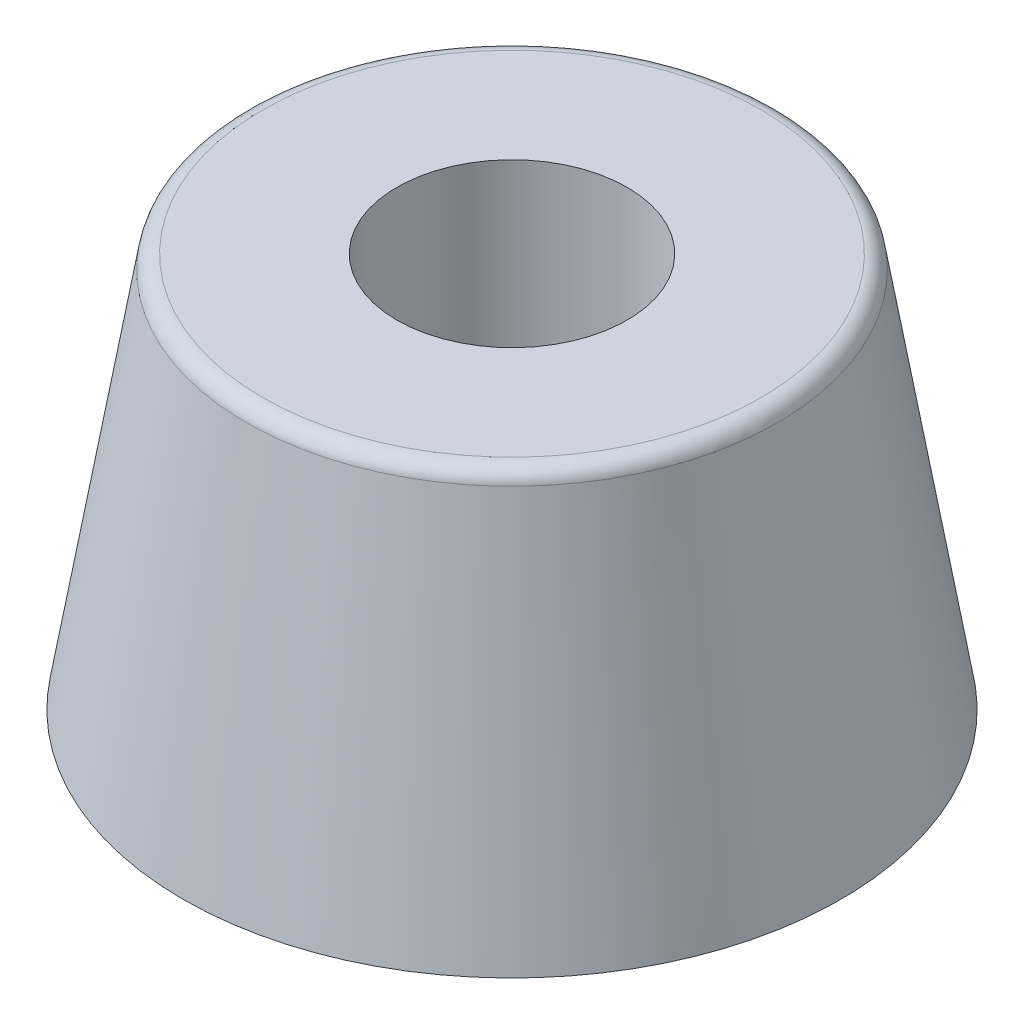
ISO-10303-21;
HEADER;
FILE_DESCRIPTION(('STEP AP214'),'2;1');
FILE_NAME('part.step','',(''),(''),'','','');
FILE_SCHEMA(('AUTOMOTIVE_DESIGN { 1 0 10303 214 1 1 1 1 }'));
ENDSEC;
DATA;
#1=APPLICATION_CONTEXT('core data for automotive mechanical design processes');
#2=APPLICATION_PROTOCOL_DEFINITION('international standard','automotive_design',2000,#1);
#3=PRODUCT_CONTEXT('',#1,'mechanical');
#4=PRODUCT('Part','Part','',(#3));
#5=PRODUCT_RELATED_PRODUCT_CATEGORY('part','',(#4));
#6=PRODUCT_DEFINITION_FORMATION('','',#4);
#7=PRODUCT_DEFINITION_CONTEXT('part definition',#1,'design');
#8=PRODUCT_DEFINITION('design','',#6,#7);
#9=PRODUCT_DEFINITION_SHAPE('','',#8);
#10=(LENGTH_UNIT() NAMED_UNIT(*) SI_UNIT(.MILLI.,.METRE.));
#11=(NAMED_UNIT(*) PLANE_ANGLE_UNIT() SI_UNIT($,.RADIAN.));
#12=(NAMED_UNIT(*) SI_UNIT($,.STERADIAN.) SOLID_ANGLE_UNIT());
#13=UNCERTAINTY_MEASURE_WITH_UNIT(LENGTH_MEASURE(1.E-05),#10,'distance_accuracy_value','');
#14=(GEOMETRIC_REPRESENTATION_CONTEXT(3) GLOBAL_UNCERTAINTY_ASSIGNED_CONTEXT((#13)) GLOBAL_UNIT_ASSIGNED_CONTEXT((#10,
#11,#12)) REPRESENTATION_CONTEXT('',''));
#15=CARTESIAN_POINT('',(0.,0.,0.));
#16=DIRECTION('',(0.,0.,1.));
#17=DIRECTION('',(1.,0.,0.));
#18=AXIS2_PLACEMENT_3D('',#15,#16,#17);
#19=CARTESIAN_POINT('',(0.,0.,0.));
#20=DIRECTION('',(0.,1.,0.));
#21=DIRECTION('',(0.,0.,-1.));
#22=AXIS2_PLACEMENT_3D('',#19,#20,#21);
#23=CYLINDRICAL_SURFACE('',#22,4.5);
#24=CARTESIAN_POINT('',(0.,3.8,0.));
#25=DIRECTION('',(0.,-1.,0.));
#26=DIRECTION('',(0.,0.,-1.));
#27=AXIS2_PLACEMENT_3D('',#24,#25,#26);
#28=CIRCLE('',#27,4.5);
#29=CARTESIAN_POINT('',(0.,3.8,-4.5));
#30=VERTEX_POINT('',#29);
#31=EDGE_CURVE('P0_E85',#30,#30,#28,.T.);
#32=ORIENTED_EDGE('',*,*,#31,.T.);
#33=EDGE_LOOP('',(#32));
#34=FACE_BOUND('',#33,.T.);
#35=CARTESIAN_POINT('',(0.,5.,0.));
#36=DIRECTION('',(0.,-1.,0.));
#37=DIRECTION('',(0.,0.,-1.));
#38=AXIS2_PLACEMENT_3D('',#35,#36,#37);
#39=CIRCLE('',#38,4.5);
#40=CARTESIAN_POINT('',(0.,5.,-4.5));
#41=VERTEX_POINT('',#40);
#42=EDGE_CURVE('P0_E11',#41,#41,#39,.T.);
#43=ORIENTED_EDGE('',*,*,#42,.F.);
#44=EDGE_LOOP('',(#43));
#45=FACE_BOUND('',#44,.T.);
#46=ADVANCED_FACE('P0_F17',(#34,#45),#23,.F.);
#47=CARTESIAN_POINT('',(3.5,5.,0.));
#48=DIRECTION('',(0.,-1.,0.));
#49=DIRECTION('',(0.,0.,-1.));
#50=AXIS2_PLACEMENT_3D('',#47,#48,#49);
#51=PLANE('',#50);
#52=CARTESIAN_POINT('',(0.,5.,0.));
#53=DIRECTION('',(0.,-1.,0.));
#54=DIRECTION('',(0.,0.,-1.));
#55=AXIS2_PLACEMENT_3D('',#52,#53,#54);
#56=CIRCLE('',#55,3.5);
#57=CARTESIAN_POINT('',(0.,5.,-3.5));
#58=VERTEX_POINT('',#57);
#59=EDGE_CURVE('P0_E21',#58,#58,#56,.T.);
#60=ORIENTED_EDGE('',*,*,#59,.F.);
#61=EDGE_LOOP('',(#60));
#62=FACE_BOUND('',#61,.T.);
#63=ORIENTED_EDGE('',*,*,#42,.T.);
#64=EDGE_LOOP('',(#63));
#65=FACE_BOUND('',#64,.T.);
#66=ADVANCED_FACE('P0_F116',(#62,#65),#51,.T.);
#67=CARTESIAN_POINT('',(0.,0.,0.));
#68=DIRECTION('',(0.,1.,0.));
#69=DIRECTION('',(0.,0.,-1.));
#70=AXIS2_PLACEMENT_3D('',#67,#68,#69);
#71=CYLINDRICAL_SURFACE('',#70,3.5);
#72=ORIENTED_EDGE('',*,*,#59,.T.);
#73=EDGE_LOOP('',(#72));
#74=FACE_BOUND('',#73,.T.);
#75=CARTESIAN_POINT('',(0.,12.,0.));
#76=DIRECTION('',(0.,-1.,0.));
#77=DIRECTION('',(0.,0.,-1.));
#78=AXIS2_PLACEMENT_3D('',#75,#76,#77);
#79=CIRCLE('',#78,3.5);
#80=CARTESIAN_POINT('',(0.,12.,-3.5));
#81=VERTEX_POINT('',#80);
#82=EDGE_CURVE('P0_E89',#81,#81,#79,.T.);
#83=ORIENTED_EDGE('',*,*,#82,.F.);
#84=EDGE_LOOP('',(#83));
#85=FACE_BOUND('',#84,.T.);
#86=ADVANCED_FACE('P0_F121',(#74,#85),#71,.F.);
#87=CARTESIAN_POINT('',(7.57643645580848,12.,0.));
#88=DIRECTION('',(0.,1.,0.));
#89=DIRECTION('',(1.,0.,0.));
#90=AXIS2_PLACEMENT_3D('',#87,#88,#89);
#91=PLANE('',#90);
#92=ORIENTED_EDGE('',*,*,#82,.T.);
#93=EDGE_LOOP('',(#92));
#94=FACE_BOUND('',#93,.T.);
#95=CARTESIAN_POINT('',(0.,12.,0.));
#96=DIRECTION('',(0.,-1.,0.));
#97=DIRECTION('',(0.,0.,-1.));
#98=AXIS2_PLACEMENT_3D('',#95,#96,#97);
#99=CIRCLE('',#98,7.57643645580848);
#100=CARTESIAN_POINT('',(0.,12.,-7.57643645580848));
#101=VERTEX_POINT('',#100);
#102=EDGE_CURVE('P0_E93',#101,#101,#99,.T.);
#103=ORIENTED_EDGE('',*,*,#102,.F.);
#104=EDGE_LOOP('',(#103));
#105=FACE_BOUND('',#104,.T.);
#106=ADVANCED_FACE('P0_F129',(#94,#105),#91,.T.);
#107=CARTESIAN_POINT('',(0.,11.5,0.));
#108=DIRECTION('',(0.,-1.,0.));
#109=DIRECTION('',(0.,0.,-1.));
#110=AXIS2_PLACEMENT_3D('',#107,#108,#109);
#111=TOROIDAL_SURFACE('',#110,7.57643645580848,0.5);
#112=ORIENTED_EDGE('',*,*,#102,.T.);
#113=EDGE_LOOP('',(#112));
#114=FACE_BOUND('',#113,.T.);
#115=CARTESIAN_POINT('',(0.,11.5821994936527,0.));
#116=DIRECTION('',(0.,-1.,0.));
#117=DIRECTION('',(0.,0.,-1.));
#118=AXIS2_PLACEMENT_3D('',#115,#116,#117);
#119=CIRCLE('',#118,8.06963341772455);
#120=CARTESIAN_POINT('',(0.,11.5821994936527,-8.06963341772455));
#121=VERTEX_POINT('',#120);
#122=EDGE_CURVE('P0_E49',#121,#121,#119,.T.);
#123=ORIENTED_EDGE('',*,*,#122,.F.);
#124=EDGE_LOOP('',(#123));
#125=FACE_BOUND('',#124,.T.);
#126=ADVANCED_FACE('P0_F128',(#114,#125),#111,.T.);
#127=CARTESIAN_POINT('',(0.,0.,0.));
#128=DIRECTION('',(0.,-1.,0.));
#129=DIRECTION('',(0.,0.,-1.));
#130=AXIS2_PLACEMENT_3D('',#127,#128,#129);
#131=CONICAL_SURFACE('',#130,10.,0.165148677414626);
#132=ORIENTED_EDGE('',*,*,#122,.T.);
#133=EDGE_LOOP('',(#132));
#134=FACE_BOUND('',#133,.T.);
#135=CARTESIAN_POINT('',(0.,0.,0.));
#136=DIRECTION('',(0.,-1.,0.));
#137=DIRECTION('',(0.,0.,-1.));
#138=AXIS2_PLACEMENT_3D('',#135,#136,#137);
#139=CIRCLE('',#138,10.);
#140=CARTESIAN_POINT('',(0.,0.,-10.));
#141=VERTEX_POINT('',#140);
#142=EDGE_CURVE('P0_E60',#141,#141,#139,.T.);
#143=ORIENTED_EDGE('',*,*,#142,.F.);
#144=EDGE_LOOP('',(#143));
#145=FACE_BOUND('',#144,.T.);
#146=ADVANCED_FACE('P0_F112',(#134,#145),#131,.T.);
#147=CARTESIAN_POINT('',(2.,0.,0.));
#148=DIRECTION('',(0.,-1.,0.));
#149=DIRECTION('',(0.,0.,-1.));
#150=AXIS2_PLACEMENT_3D('',#147,#148,#149);
#151=PLANE('',#150);
#152=CARTESIAN_POINT('',(0.,0.,0.));
#153=DIRECTION('',(0.,-1.,0.));
#154=DIRECTION('',(0.,0.,-1.));
#155=AXIS2_PLACEMENT_3D('',#152,#153,#154);
#156=CIRCLE('',#155,2.);
#157=CARTESIAN_POINT('',(0.,0.,-2.));
#158=VERTEX_POINT('',#157);
#159=EDGE_CURVE('P0_E80',#158,#158,#156,.T.);
#160=ORIENTED_EDGE('',*,*,#159,.F.);
#161=EDGE_LOOP('',(#160));
#162=FACE_BOUND('',#161,.T.);
#163=ORIENTED_EDGE('',*,*,#142,.T.);
#164=EDGE_LOOP('',(#163));
#165=FACE_BOUND('',#164,.T.);
#166=ADVANCED_FACE('P0_F104',(#162,#165),#151,.T.);
#167=CARTESIAN_POINT('',(4.5,3.8,0.));
#168=DIRECTION('',(0.,1.,0.));
#169=DIRECTION('',(1.,0.,0.));
#170=AXIS2_PLACEMENT_3D('',#167,#168,#169);
#171=PLANE('',#170);
#172=CARTESIAN_POINT('',(0.,3.8,0.));
#173=DIRECTION('',(0.,-1.,0.));
#174=DIRECTION('',(0.,0.,-1.));
#175=AXIS2_PLACEMENT_3D('',#172,#173,#174);
#176=CIRCLE('',#175,2.);
#177=CARTESIAN_POINT('',(0.,3.8,-2.));
#178=VERTEX_POINT('',#177);
#179=EDGE_CURVE('P0_E75',#178,#178,#176,.T.);
#180=ORIENTED_EDGE('',*,*,#179,.T.);
#181=EDGE_LOOP('',(#180));
#182=FACE_BOUND('',#181,.T.);
#183=ORIENTED_EDGE('',*,*,#31,.F.);
#184=EDGE_LOOP('',(#183));
#185=FACE_BOUND('',#184,.T.);
#186=ADVANCED_FACE('P0_F76',(#182,#185),#171,.T.);
#187=CARTESIAN_POINT('',(0.,0.,0.));
#188=DIRECTION('',(0.,1.,0.));
#189=DIRECTION('',(0.,0.,-1.));
#190=AXIS2_PLACEMENT_3D('',#187,#188,#189);
#191=CYLINDRICAL_SURFACE('',#190,2.);
#192=ORIENTED_EDGE('',*,*,#159,.T.);
#193=EDGE_LOOP('',(#192));
#194=FACE_BOUND('',#193,.T.);
#195=ORIENTED_EDGE('',*,*,#179,.F.);
#196=EDGE_LOOP('',(#195));
#197=FACE_BOUND('',#196,.T.);
#198=ADVANCED_FACE('P0_F19',(#194,#197),#191,.F.);
#199=CLOSED_SHELL('',(#46,#66,#86,#106,#126,#146,#166,#186,#198));
#200=MANIFOLD_SOLID_BREP('P0_B1',#199);
#201=CARTESIAN_POINT('',(0.,5.,0.));
#202=DIRECTION('',(0.,-1.,0.));
#203=DIRECTION('',(0.,0.,1.));
#204=AXIS2_PLACEMENT_3D('',#201,#202,#203);
#205=CYLINDRICAL_SURFACE('',#204,4.5);
#206=CARTESIAN_POINT('',(0.,3.8,0.));
#207=DIRECTION('',(0.,1.,0.));
#208=DIRECTION('',(0.,0.,1.));
#209=AXIS2_PLACEMENT_3D('',#206,#207,#208);
#210=CIRCLE('',#209,4.5);
#211=CARTESIAN_POINT('',(0.,3.8,4.5));
#212=VERTEX_POINT('',#211);
#213=EDGE_CURVE('P1_E25',#212,#212,#210,.T.);
#214=ORIENTED_EDGE('',*,*,#213,.T.);
#215=EDGE_LOOP('',(#214));
#216=FACE_BOUND('',#215,.T.);
#217=CARTESIAN_POINT('',(0.,5.,0.));
#218=DIRECTION('',(0.,1.,0.));
#219=DIRECTION('',(0.,0.,1.));
#220=AXIS2_PLACEMENT_3D('',#217,#218,#219);
#221=CIRCLE('',#220,4.5);
#222=CARTESIAN_POINT('',(0.,5.,4.5));
#223=VERTEX_POINT('',#222);
#224=EDGE_CURVE('P1_E10',#223,#223,#221,.T.);
#225=ORIENTED_EDGE('',*,*,#224,.F.);
#226=EDGE_LOOP('',(#225));
#227=FACE_BOUND('',#226,.T.);
#228=ADVANCED_FACE('P1_F16',(#216,#227),#205,.T.);
#229=CARTESIAN_POINT('',(2.,5.,0.));
#230=DIRECTION('',(0.,1.,0.));
#231=DIRECTION('',(0.,0.,1.));
#232=AXIS2_PLACEMENT_3D('',#229,#230,#231);
#233=PLANE('',#232);
#234=CARTESIAN_POINT('',(0.,5.,0.));
#235=DIRECTION('',(0.,1.,0.));
#236=DIRECTION('',(0.,0.,1.));
#237=AXIS2_PLACEMENT_3D('',#234,#235,#236);
#238=CIRCLE('',#237,2.);
#239=CARTESIAN_POINT('',(0.,5.,2.));
#240=VERTEX_POINT('',#239);
#241=EDGE_CURVE('P1_E54',#240,#240,#238,.T.);
#242=ORIENTED_EDGE('',*,*,#241,.F.);
#243=EDGE_LOOP('',(#242));
#244=FACE_BOUND('',#243,.T.);
#245=ORIENTED_EDGE('',*,*,#224,.T.);
#246=EDGE_LOOP('',(#245));
#247=FACE_BOUND('',#246,.T.);
#248=ADVANCED_FACE('P1_F70',(#244,#247),#233,.T.);
#249=CARTESIAN_POINT('',(4.5,3.8,0.));
#250=DIRECTION('',(0.,-1.,0.));
#251=DIRECTION('',(1.,0.,0.));
#252=AXIS2_PLACEMENT_3D('',#249,#250,#251);
#253=PLANE('',#252);
#254=CARTESIAN_POINT('',(0.,3.8,0.));
#255=DIRECTION('',(0.,1.,0.));
#256=DIRECTION('',(0.,0.,1.));
#257=AXIS2_PLACEMENT_3D('',#254,#255,#256);
#258=CIRCLE('',#257,2.);
#259=CARTESIAN_POINT('',(0.,3.8,2.));
#260=VERTEX_POINT('',#259);
#261=EDGE_CURVE('P1_E49',#260,#260,#258,.T.);
#262=ORIENTED_EDGE('',*,*,#261,.T.);
#263=EDGE_LOOP('',(#262));
#264=FACE_BOUND('',#263,.T.);
#265=ORIENTED_EDGE('',*,*,#213,.F.);
#266=EDGE_LOOP('',(#265));
#267=FACE_BOUND('',#266,.T.);
#268=ADVANCED_FACE('P1_F50',(#264,#267),#253,.T.);
#269=CARTESIAN_POINT('',(0.,5.,0.));
#270=DIRECTION('',(0.,-1.,0.));
#271=DIRECTION('',(0.,0.,1.));
#272=AXIS2_PLACEMENT_3D('',#269,#270,#271);
#273=CYLINDRICAL_SURFACE('',#272,2.);
#274=ORIENTED_EDGE('',*,*,#241,.T.);
#275=EDGE_LOOP('',(#274));
#276=FACE_BOUND('',#275,.T.);
#277=ORIENTED_EDGE('',*,*,#261,.F.);
#278=EDGE_LOOP('',(#277));
#279=FACE_BOUND('',#278,.T.);
#280=ADVANCED_FACE('P1_F18',(#276,#279),#273,.F.);
#281=CLOSED_SHELL('',(#228,#248,#268,#280));
#282=MANIFOLD_SOLID_BREP('P1_B1',#281);
#283=ADVANCED_BREP_SHAPE_REPRESENTATION('',(#18,#200,#282),#14);
#284=SHAPE_DEFINITION_REPRESENTATION(#9,#283);
ENDSEC;
END-ISO-10303-21;
